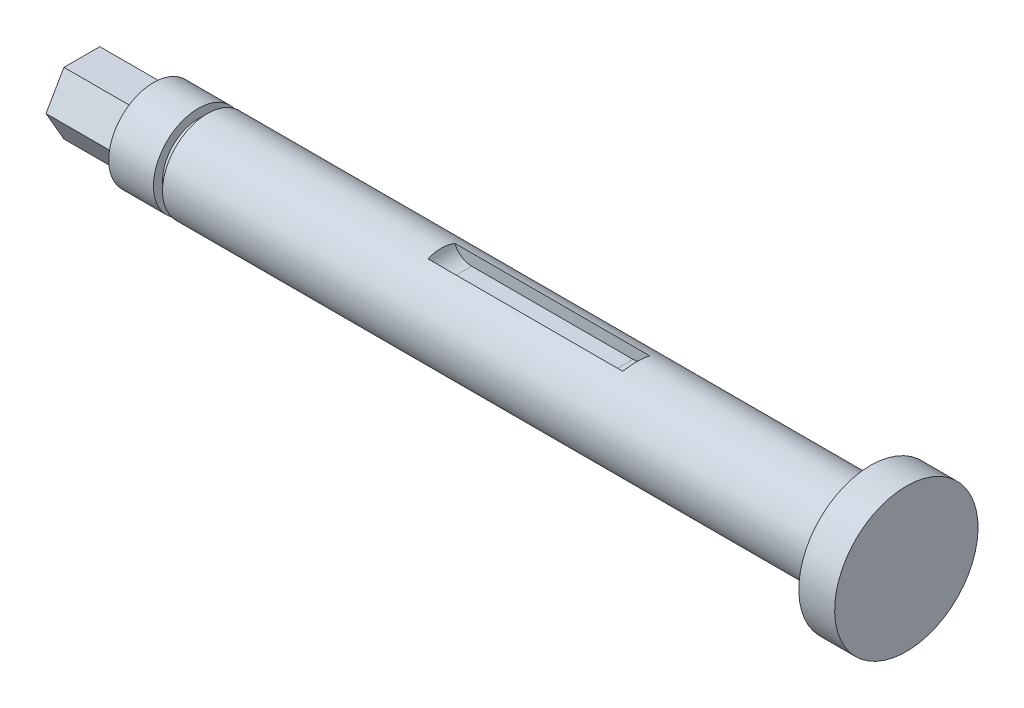
ISO-10303-21;
HEADER;
FILE_DESCRIPTION(('STEP AP214'),'2;1');
FILE_NAME('part.step','',(''),(''),'','','');
FILE_SCHEMA(('AUTOMOTIVE_DESIGN { 1 0 10303 214 1 1 1 1 }'));
ENDSEC;
DATA;
#1=APPLICATION_CONTEXT('core data for automotive mechanical design processes');
#2=APPLICATION_PROTOCOL_DEFINITION('international standard','automotive_design',2000,#1);
#3=PRODUCT_CONTEXT('',#1,'mechanical');
#4=PRODUCT('Part','Part','',(#3));
#5=PRODUCT_RELATED_PRODUCT_CATEGORY('part','',(#4));
#6=PRODUCT_DEFINITION_FORMATION('','',#4);
#7=PRODUCT_DEFINITION_CONTEXT('part definition',#1,'design');
#8=PRODUCT_DEFINITION('design','',#6,#7);
#9=PRODUCT_DEFINITION_SHAPE('','',#8);
#10=(LENGTH_UNIT() NAMED_UNIT(*) SI_UNIT(.MILLI.,.METRE.));
#11=(NAMED_UNIT(*) PLANE_ANGLE_UNIT() SI_UNIT($,.RADIAN.));
#12=(NAMED_UNIT(*) SI_UNIT($,.STERADIAN.) SOLID_ANGLE_UNIT());
#13=UNCERTAINTY_MEASURE_WITH_UNIT(LENGTH_MEASURE(1.E-05),#10,'distance_accuracy_value','');
#14=(GEOMETRIC_REPRESENTATION_CONTEXT(3) GLOBAL_UNCERTAINTY_ASSIGNED_CONTEXT((#13)) GLOBAL_UNIT_ASSIGNED_CONTEXT((#10,
#11,#12)) REPRESENTATION_CONTEXT('',''));
#15=CARTESIAN_POINT('',(0.,0.,0.));
#16=DIRECTION('',(0.,0.,1.));
#17=DIRECTION('',(1.,0.,0.));
#18=AXIS2_PLACEMENT_3D('',#15,#16,#17);
#19=CARTESIAN_POINT('',(-46.1818181818182,-7.85119649136424,0.));
#20=DIRECTION('',(1.,0.,0.));
#21=DIRECTION('',(0.,1.,0.));
#22=AXIS2_PLACEMENT_3D('',#19,#20,#21);
#23=CYLINDRICAL_SURFACE('',#22,7.93750000000001);
#24=CARTESIAN_POINT('',(-23.9568181818182,-7.85119649136424,0.));
#25=DIRECTION('',(1.,0.,0.));
#26=DIRECTION('',(0.,1.,0.));
#27=AXIS2_PLACEMENT_3D('',#24,#25,#26);
#28=CIRCLE('',#27,7.93750000000001);
#29=CARTESIAN_POINT('',(-23.9568181818182,0.086303508635777,0.));
#30=VERTEX_POINT('',#29);
#31=EDGE_CURVE('E188',#30,#30,#28,.T.);
#32=ORIENTED_EDGE('',*,*,#31,.T.);
#33=EDGE_LOOP('',(#32));
#34=FACE_BOUND('',#33,.T.);
#35=CARTESIAN_POINT('',(93.5181818181818,-7.85119649136422,0.));
#36=DIRECTION('',(1.,0.,0.));
#37=DIRECTION('',(0.,1.,0.));
#38=AXIS2_PLACEMENT_3D('',#35,#36,#37);
#39=CIRCLE('',#38,7.9375);
#40=CARTESIAN_POINT('',(93.5181818181818,0.086303508635777,0.));
#41=VERTEX_POINT('',#40);
#42=EDGE_CURVE('E185',#41,#41,#39,.T.);
#43=ORIENTED_EDGE('',*,*,#42,.F.);
#44=EDGE_LOOP('',(#43));
#45=FACE_BOUND('',#44,.T.);
#46=CARTESIAN_POINT('',(17.5349393500467,-0.279304080117218,-2.38125));
#47=CARTESIAN_POINT('',(17.5228895185475,-0.248359009768618,-2.28286114644571));
#48=CARTESIAN_POINT('',(17.5121096844206,-0.219295454956569,-2.18373394589652));
#49=CARTESIAN_POINT('',(17.4927586231369,-0.165013650373672,-1.98423094459988));
#50=CARTESIAN_POINT('',(17.4841871294751,-0.139794936753269,-1.88385529605055));
#51=CARTESIAN_POINT('',(17.4689224225592,-0.0932891865647346,-1.68210998868868));
#52=CARTESIAN_POINT('',(17.4622282739744,-0.0720001939449012,-1.58074085099974));
#53=CARTESIAN_POINT('',(17.4504514512222,-0.0333916842622112,-1.37716069329768));
#54=CARTESIAN_POINT('',(17.4453688229289,-0.0160722802029891,-1.2749496494035));
#55=CARTESIAN_POINT('',(17.4324227039563,0.0290913406343379,-0.972518602068045));
#56=CARTESIAN_POINT('',(17.4264980886517,0.0513241253093232,-0.771346365920783));
#57=CARTESIAN_POINT('',(17.4188612392676,0.0803582607489661,-0.367812192026644));
#58=CARTESIAN_POINT('',(17.4171495572141,0.0871575892391459,-0.165450101853548));
#59=CARTESIAN_POINT('',(17.4176245938068,0.0853059424343584,0.233209512953236));
#60=CARTESIAN_POINT('',(17.4196975229765,0.0771059287528459,0.429509408207358));
#61=CARTESIAN_POINT('',(17.4278765675394,0.0461819701231616,0.820870390108004));
#62=CARTESIAN_POINT('',(17.4339819769679,0.0234605674509423,1.01593168756148));
#63=CARTESIAN_POINT('',(17.4470306845615,-0.0217461985024105,1.30909544958882));
#64=CARTESIAN_POINT('',(17.4521157000533,-0.0389505457295152,1.40812396106605));
#65=CARTESIAN_POINT('',(17.4638218599536,-0.077087432528018,1.60537279101093));
#66=CARTESIAN_POINT('',(17.4704429621607,-0.0980198696729293,1.70359313160493));
#67=CARTESIAN_POINT('',(17.4854669834366,-0.143574944955858,1.89909267282386));
#68=CARTESIAN_POINT('',(17.4938708418505,-0.168199526493752,1.99637134891407));
#69=CARTESIAN_POINT('',(17.5127643709573,-0.221060949573087,2.18974831448237));
#70=CARTESIAN_POINT('',(17.5232542782489,-0.249298200731986,2.28584646875236));
#71=CARTESIAN_POINT('',(17.5349393500467,-0.279304080117219,2.38125));
#72=B_SPLINE_CURVE_WITH_KNOTS('',3,(#46,#47,#48,#49,#50,#51,#52,#53,#54,#55,#56,#57,#58,#59,#60,
#61,#62,#63,#64,#65,#66,#67,#68,#69,#70,#71),.UNSPECIFIED.,.F.,.F.,(4,2,2,2,2,2,2,2,2,2,2,2,4),
(0.,0.311486004627484,0.622934401155594,0.934227351103226,1.24552916163332,1.85227877141674,
2.459107880142,3.04799138422071,3.63677182003086,3.93862384263224,4.24046757335365,
4.54247074416797,4.84450818758329),.UNSPECIFIED.);
#73=CARTESIAN_POINT('',(17.5349393500467,-0.27930408011722,-2.38125));
#74=VERTEX_POINT('',#73);
#75=CARTESIAN_POINT('',(17.5349393500467,-0.27930408011722,2.38125));
#76=VERTEX_POINT('',#75);
#77=EDGE_CURVE('E205',#74,#76,#72,.T.);
#78=ORIENTED_EDGE('',*,*,#77,.F.);
#79=DIRECTION('',(1.,0.,0.));
#80=VECTOR('',#79,1.);
#81=CARTESIAN_POINT('',(-46.1818181818182,-0.279304080117227,-2.38125));
#82=LINE('',#81,#80);
#83=CARTESIAN_POINT('',(52.0264242863169,-0.279304080117215,-2.38125));
#84=VERTEX_POINT('',#83);
#85=EDGE_CURVE('E12',#74,#84,#82,.T.);
#86=ORIENTED_EDGE('',*,*,#85,.T.);
#87=CARTESIAN_POINT('',(52.0264242863169,-0.279304080117214,2.38125));
#88=CARTESIAN_POINT('',(52.0384741178162,-0.248359009768613,2.2828611464457));
#89=CARTESIAN_POINT('',(52.049253951943,-0.219295454956564,2.18373394589652));
#90=CARTESIAN_POINT('',(52.0686050132267,-0.165013650373667,1.98423094459988));
#91=CARTESIAN_POINT('',(52.0771765068885,-0.139794936753264,1.88385529605055));
#92=CARTESIAN_POINT('',(52.0924412138044,-0.09328918656473,1.68210998868868));
#93=CARTESIAN_POINT('',(52.0991353623892,-0.0720001939448968,1.58074085099974));
#94=CARTESIAN_POINT('',(52.1109121851415,-0.0333916842622071,1.37716069329768));
#95=CARTESIAN_POINT('',(52.1159948134348,-0.0160722802029851,1.2749496494035));
#96=CARTESIAN_POINT('',(52.1289409324073,0.0290913406343422,0.972518602068043));
#97=CARTESIAN_POINT('',(52.134865547712,0.0513241253093284,0.771346365920782));
#98=CARTESIAN_POINT('',(52.1425023970961,0.0803582607489722,0.367812192026645));
#99=CARTESIAN_POINT('',(52.1442140791496,0.0871575892391522,0.165450101853549));
#100=CARTESIAN_POINT('',(52.1437390425569,0.0853059424343649,-0.233209512953235));
#101=CARTESIAN_POINT('',(52.1416661133871,0.0771059287528523,-0.429509408207358));
#102=CARTESIAN_POINT('',(52.1334870688243,0.0461819701231663,-0.820870390108004));
#103=CARTESIAN_POINT('',(52.1273816593957,0.0234605674509453,-1.01593168756148));
#104=CARTESIAN_POINT('',(52.1143329518021,-0.0217461985024063,-1.30909544958883));
#105=CARTESIAN_POINT('',(52.1092479363103,-0.0389505457295099,-1.40812396106605));
#106=CARTESIAN_POINT('',(52.0975417764101,-0.0770874325280125,-1.60537279101093));
#107=CARTESIAN_POINT('',(52.090920674203,-0.0980198696729246,-1.70359313160493));
#108=CARTESIAN_POINT('',(52.0758966529271,-0.143574944955855,-1.89909267282387));
#109=CARTESIAN_POINT('',(52.0674927945132,-0.168199526493749,-1.99637134891407));
#110=CARTESIAN_POINT('',(52.0485992654063,-0.221060949573085,-2.18974831448238));
#111=CARTESIAN_POINT('',(52.0381093581148,-0.249298200731984,-2.28584646875237));
#112=CARTESIAN_POINT('',(52.0264242863169,-0.279304080117216,-2.38125));
#113=B_SPLINE_CURVE_WITH_KNOTS('',3,(#87,#88,#89,#90,#91,#92,#93,#94,#95,#96,#97,#98,#99,#100,
#101,#102,#103,#104,#105,#106,#107,#108,#109,#110,#111,#112),.UNSPECIFIED.,.F.,.F.,(4,2,2,2,2,2,
2,2,2,2,2,2,4),(0.,0.311486004627484,0.622934401155592,0.934227351103225,1.24552916163332,
1.85227877141674,2.459107880142,3.04799138422071,3.63677182003085,3.93862384263224,
4.24046757335365,4.54247074416797,4.84450818758329),.UNSPECIFIED.);
#114=CARTESIAN_POINT('',(52.0264242863169,-0.279304080117215,2.38125));
#115=VERTEX_POINT('',#114);
#116=EDGE_CURVE('E45',#115,#84,#113,.T.);
#117=ORIENTED_EDGE('',*,*,#116,.F.);
#118=DIRECTION('',(1.,0.,0.));
#119=VECTOR('',#118,1.);
#120=CARTESIAN_POINT('',(-46.1818181818182,-0.279304080117227,2.38125));
#121=LINE('',#120,#119);
#122=EDGE_CURVE('E203',#76,#115,#121,.T.);
#123=ORIENTED_EDGE('',*,*,#122,.F.);
#124=EDGE_LOOP('',(#78,#86,#117,#123));
#125=FACE_BOUND('',#124,.T.);
#126=ADVANCED_FACE('F37',(#34,#45,#125),#23,.T.);
#127=CARTESIAN_POINT('',(-33.4818181818182,-1.50119649136424,0.));
#128=DIRECTION('',(-1.,0.,0.));
#129=DIRECTION('',(0.,-1.,0.));
#130=AXIS2_PLACEMENT_3D('',#127,#128,#129);
#131=PLANE('',#130);
#132=DIRECTION('',(0.,0.,-1.));
#133=VECTOR('',#132,1.);
#134=CARTESIAN_POINT('',(-33.4818181818182,-13.3504578053955,-3.17499999999995));
#135=LINE('',#134,#133);
#136=CARTESIAN_POINT('',(-33.4818181818182,-13.3504578053954,3.17500000000007));
#137=VERTEX_POINT('',#136);
#138=CARTESIAN_POINT('',(-33.4818181818182,-13.3504578053955,-3.17499999999995));
#139=VERTEX_POINT('',#138);
#140=EDGE_CURVE('E60',#137,#139,#135,.T.);
#141=ORIENTED_EDGE('',*,*,#140,.T.);
#142=DIRECTION('',(0.,0.866025403784435,-0.500000000000007));
#143=VECTOR('',#142,1.);
#144=CARTESIAN_POINT('',(-33.4818181818182,-7.85119649136428,-6.35));
#145=LINE('',#144,#143);
#146=CARTESIAN_POINT('',(-33.4818181818182,-7.85119649136429,-6.35));
#147=VERTEX_POINT('',#146);
#148=EDGE_CURVE('E310',#139,#147,#145,.T.);
#149=ORIENTED_EDGE('',*,*,#148,.T.);
#150=DIRECTION('',(0.,0.866025403784442,0.499999999999995));
#151=VECTOR('',#150,1.);
#152=CARTESIAN_POINT('',(-33.4818181818182,-2.35193517733307,-3.17500000000003));
#153=LINE('',#152,#151);
#154=CARTESIAN_POINT('',(-33.4818181818182,-2.35193517733307,-3.17500000000003));
#155=VERTEX_POINT('',#154);
#156=EDGE_CURVE('E312',#147,#155,#153,.T.);
#157=ORIENTED_EDGE('',*,*,#156,.T.);
#158=DIRECTION('',(0.,0.,1.));
#159=VECTOR('',#158,1.);
#160=CARTESIAN_POINT('',(-33.4818181818182,-2.35193517733305,3.17499999999999));
#161=LINE('',#160,#159);
#162=CARTESIAN_POINT('',(-33.4818181818182,-2.35193517733304,3.17499999999998));
#163=VERTEX_POINT('',#162);
#164=EDGE_CURVE('E170',#155,#163,#161,.T.);
#165=ORIENTED_EDGE('',*,*,#164,.T.);
#166=DIRECTION('',(0.,-0.866025403784438,0.500000000000001));
#167=VECTOR('',#166,1.);
#168=CARTESIAN_POINT('',(-33.4818181818182,-7.85119649136424,6.35));
#169=LINE('',#168,#167);
#170=CARTESIAN_POINT('',(-33.4818181818182,-7.85119649136424,6.35));
#171=VERTEX_POINT('',#170);
#172=EDGE_CURVE('E118',#163,#171,#169,.T.);
#173=ORIENTED_EDGE('',*,*,#172,.T.);
#174=DIRECTION('',(0.,-0.866025403784442,-0.499999999999995));
#175=VECTOR('',#174,1.);
#176=CARTESIAN_POINT('',(-33.4818181818182,-13.3504578053954,3.17500000000006));
#177=LINE('',#176,#175);
#178=EDGE_CURVE('E156',#171,#137,#177,.T.);
#179=ORIENTED_EDGE('',*,*,#178,.T.);
#180=EDGE_LOOP('',(#141,#149,#157,#165,#173,#179));
#181=FACE_BOUND('',#180,.T.);
#182=CARTESIAN_POINT('',(-33.4818181818182,-7.85119649136424,0.));
#183=DIRECTION('',(1.,0.,0.));
#184=DIRECTION('',(0.,1.,0.));
#185=AXIS2_PLACEMENT_3D('',#182,#183,#184);
#186=CIRCLE('',#185,7.9375);
#187=CARTESIAN_POINT('',(-33.4818181818182,0.0863035086357596,0.));
#188=VERTEX_POINT('',#187);
#189=EDGE_CURVE('E200',#188,#188,#186,.T.);
#190=ORIENTED_EDGE('',*,*,#189,.F.);
#191=EDGE_LOOP('',(#190));
#192=FACE_BOUND('',#191,.T.);
#193=ADVANCED_FACE('F248',(#181,#192),#131,.T.);
#194=CARTESIAN_POINT('',(-46.1818181818182,-7.85119649136424,0.));
#195=DIRECTION('',(1.,0.,0.));
#196=DIRECTION('',(0.,1.,0.));
#197=AXIS2_PLACEMENT_3D('',#194,#195,#196);
#198=CYLINDRICAL_SURFACE('',#197,7.9375);
#199=ORIENTED_EDGE('',*,*,#189,.T.);
#200=EDGE_LOOP('',(#199));
#201=FACE_BOUND('',#200,.T.);
#202=CARTESIAN_POINT('',(-25.5570181818182,-7.85119649136424,0.));
#203=DIRECTION('',(1.,0.,0.));
#204=DIRECTION('',(0.,1.,0.));
#205=AXIS2_PLACEMENT_3D('',#202,#203,#204);
#206=CIRCLE('',#205,7.9375);
#207=CARTESIAN_POINT('',(-25.5570181818182,0.0863035086357614,0.));
#208=VERTEX_POINT('',#207);
#209=EDGE_CURVE('E197',#208,#208,#206,.T.);
#210=ORIENTED_EDGE('',*,*,#209,.F.);
#211=EDGE_LOOP('',(#210));
#212=FACE_BOUND('',#211,.T.);
#213=ADVANCED_FACE('F253',(#201,#212),#198,.T.);
#214=CARTESIAN_POINT('',(-25.5570181818182,0.0863035086357613,0.));
#215=DIRECTION('',(1.,0.,0.));
#216=DIRECTION('',(0.,1.,0.));
#217=AXIS2_PLACEMENT_3D('',#214,#215,#216);
#218=PLANE('',#217);
#219=ORIENTED_EDGE('',*,*,#209,.T.);
#220=EDGE_LOOP('',(#219));
#221=FACE_BOUND('',#220,.T.);
#222=CARTESIAN_POINT('',(-25.5570181818182,-7.85119649136424,0.));
#223=DIRECTION('',(1.,0.,0.));
#224=DIRECTION('',(0.,1.,0.));
#225=AXIS2_PLACEMENT_3D('',#222,#223,#224);
#226=CIRCLE('',#225,6.33730000000002);
#227=CARTESIAN_POINT('',(-25.5570181818182,-1.51389649136422,0.));
#228=VERTEX_POINT('',#227);
#229=EDGE_CURVE('E194',#228,#228,#226,.T.);
#230=ORIENTED_EDGE('',*,*,#229,.F.);
#231=EDGE_LOOP('',(#230));
#232=FACE_BOUND('',#231,.T.);
#233=ADVANCED_FACE('F322',(#221,#232),#218,.T.);
#234=CARTESIAN_POINT('',(-46.1818181818182,-7.85119649136424,0.));
#235=DIRECTION('',(1.,0.,0.));
#236=DIRECTION('',(0.,1.,0.));
#237=AXIS2_PLACEMENT_3D('',#234,#235,#236);
#238=CYLINDRICAL_SURFACE('',#237,6.33730000000002);
#239=ORIENTED_EDGE('',*,*,#229,.T.);
#240=EDGE_LOOP('',(#239));
#241=FACE_BOUND('',#240,.T.);
#242=CARTESIAN_POINT('',(-23.9568181818182,-7.85119649136424,0.));
#243=DIRECTION('',(1.,0.,0.));
#244=DIRECTION('',(0.,1.,0.));
#245=AXIS2_PLACEMENT_3D('',#242,#243,#244);
#246=CIRCLE('',#245,6.33730000000002);
#247=CARTESIAN_POINT('',(-23.9568181818182,-1.51389649136422,0.));
#248=VERTEX_POINT('',#247);
#249=EDGE_CURVE('E191',#248,#248,#246,.T.);
#250=ORIENTED_EDGE('',*,*,#249,.F.);
#251=EDGE_LOOP('',(#250));
#252=FACE_BOUND('',#251,.T.);
#253=ADVANCED_FACE('F244',(#241,#252),#238,.T.);
#254=CARTESIAN_POINT('',(-23.9568181818182,0.086303508635777,0.));
#255=DIRECTION('',(-1.,0.,0.));
#256=DIRECTION('',(0.,-1.,0.));
#257=AXIS2_PLACEMENT_3D('',#254,#255,#256);
#258=PLANE('',#257);
#259=ORIENTED_EDGE('',*,*,#249,.T.);
#260=EDGE_LOOP('',(#259));
#261=FACE_BOUND('',#260,.T.);
#262=ORIENTED_EDGE('',*,*,#31,.F.);
#263=EDGE_LOOP('',(#262));
#264=FACE_BOUND('',#263,.T.);
#265=ADVANCED_FACE('F239',(#261,#264),#258,.T.);
#266=CARTESIAN_POINT('',(93.5181818181818,4.84880350863578,0.));
#267=DIRECTION('',(-1.,0.,0.));
#268=DIRECTION('',(0.,-1.,0.));
#269=AXIS2_PLACEMENT_3D('',#266,#267,#268);
#270=PLANE('',#269);
#271=ORIENTED_EDGE('',*,*,#42,.T.);
#272=EDGE_LOOP('',(#271));
#273=FACE_BOUND('',#272,.T.);
#274=CARTESIAN_POINT('',(93.5181818181818,-7.85119649136422,0.));
#275=DIRECTION('',(1.,0.,0.));
#276=DIRECTION('',(0.,1.,0.));
#277=AXIS2_PLACEMENT_3D('',#274,#275,#276);
#278=CIRCLE('',#277,12.7);
#279=CARTESIAN_POINT('',(93.5181818181818,4.84880350863578,0.));
#280=VERTEX_POINT('',#279);
#281=EDGE_CURVE('E182',#280,#280,#278,.T.);
#282=ORIENTED_EDGE('',*,*,#281,.F.);
#283=EDGE_LOOP('',(#282));
#284=FACE_BOUND('',#283,.T.);
#285=ADVANCED_FACE('F236',(#273,#284),#270,.T.);
#286=CARTESIAN_POINT('',(-46.1818181818182,-7.85119649136424,0.));
#287=DIRECTION('',(1.,0.,0.));
#288=DIRECTION('',(0.,1.,0.));
#289=AXIS2_PLACEMENT_3D('',#286,#287,#288);
#290=CYLINDRICAL_SURFACE('',#289,12.7);
#291=ORIENTED_EDGE('',*,*,#281,.T.);
#292=EDGE_LOOP('',(#291));
#293=FACE_BOUND('',#292,.T.);
#294=CARTESIAN_POINT('',(99.8681818181818,-7.85119649136422,0.));
#295=DIRECTION('',(1.,0.,0.));
#296=DIRECTION('',(0.,1.,0.));
#297=AXIS2_PLACEMENT_3D('',#294,#295,#296);
#298=CIRCLE('',#297,12.7);
#299=CARTESIAN_POINT('',(99.8681818181818,4.84880350863578,0.));
#300=VERTEX_POINT('',#299);
#301=EDGE_CURVE('E177',#300,#300,#298,.T.);
#302=ORIENTED_EDGE('',*,*,#301,.F.);
#303=EDGE_LOOP('',(#302));
#304=FACE_BOUND('',#303,.T.);
#305=ADVANCED_FACE('F233',(#293,#304),#290,.T.);
#306=CARTESIAN_POINT('',(99.8681818181818,-7.85119649136422,0.));
#307=DIRECTION('',(1.,0.,0.));
#308=DIRECTION('',(0.,1.,0.));
#309=AXIS2_PLACEMENT_3D('',#306,#307,#308);
#310=PLANE('',#309);
#311=ORIENTED_EDGE('',*,*,#301,.T.);
#312=EDGE_LOOP('',(#311));
#313=FACE_BOUND('',#312,.T.);
#314=ADVANCED_FACE('F229',(#313),#310,.T.);
#315=CARTESIAN_POINT('',(49.0681818181818,0.873703508635783,-2.38125));
#316=DIRECTION('',(0.,0.,1.));
#317=DIRECTION('',(1.,0.,0.));
#318=AXIS2_PLACEMENT_3D('',#315,#316,#317);
#319=CYLINDRICAL_SURFACE('',#318,3.175);
#320=ORIENTED_EDGE('',*,*,#116,.T.);
#321=CARTESIAN_POINT('',(49.0681818181818,0.873703508635783,-2.38125));
#322=DIRECTION('',(0.,0.,1.));
#323=DIRECTION('',(1.,0.,0.));
#324=AXIS2_PLACEMENT_3D('',#321,#322,#323);
#325=CIRCLE('',#324,3.175);
#326=CARTESIAN_POINT('',(49.0681818181818,-2.30129649136422,-2.38125));
#327=VERTEX_POINT('',#326);
#328=EDGE_CURVE('E163',#327,#84,#325,.T.);
#329=ORIENTED_EDGE('',*,*,#328,.F.);
#330=DIRECTION('',(0.,0.,1.));
#331=VECTOR('',#330,1.);
#332=CARTESIAN_POINT('',(49.0681818181818,-2.30129649136422,-2.38125));
#333=LINE('',#332,#331);
#334=CARTESIAN_POINT('',(49.0681818181818,-2.30129649136422,2.38125));
#335=VERTEX_POINT('',#334);
#336=EDGE_CURVE('E175',#327,#335,#333,.T.);
#337=ORIENTED_EDGE('',*,*,#336,.T.);
#338=CARTESIAN_POINT('',(49.0681818181818,0.873703508635783,2.38125));
#339=DIRECTION('',(0.,0.,1.));
#340=DIRECTION('',(1.,0.,0.));
#341=AXIS2_PLACEMENT_3D('',#338,#339,#340);
#342=CIRCLE('',#341,3.175);
#343=EDGE_CURVE('E160',#335,#115,#342,.T.);
#344=ORIENTED_EDGE('',*,*,#343,.T.);
#345=EDGE_LOOP('',(#320,#329,#337,#344));
#346=FACE_BOUND('',#345,.T.);
#347=ADVANCED_FACE('F232',(#346),#319,.F.);
#348=CARTESIAN_POINT('',(20.4931818181818,-2.30129649136422,-2.38125));
#349=DIRECTION('',(0.,-1.,0.));
#350=DIRECTION('',(1.,0.,0.));
#351=AXIS2_PLACEMENT_3D('',#348,#349,#350);
#352=PLANE('',#351);
#353=DIRECTION('',(1.,0.,0.));
#354=VECTOR('',#353,1.);
#355=CARTESIAN_POINT('',(20.4931818181818,-2.30129649136422,2.38125));
#356=LINE('',#355,#354);
#357=CARTESIAN_POINT('',(20.4931818181818,-2.30129649136422,2.38125));
#358=VERTEX_POINT('',#357);
#359=EDGE_CURVE('E169',#358,#335,#356,.T.);
#360=ORIENTED_EDGE('',*,*,#359,.T.);
#361=ORIENTED_EDGE('',*,*,#336,.F.);
#362=DIRECTION('',(1.,0.,0.));
#363=VECTOR('',#362,1.);
#364=CARTESIAN_POINT('',(20.4931818181818,-2.30129649136422,-2.38125));
#365=LINE('',#364,#363);
#366=CARTESIAN_POINT('',(20.4931818181818,-2.30129649136422,-2.38125));
#367=VERTEX_POINT('',#366);
#368=EDGE_CURVE('E159',#367,#327,#365,.T.);
#369=ORIENTED_EDGE('',*,*,#368,.F.);
#370=DIRECTION('',(0.,0.,1.));
#371=VECTOR('',#370,1.);
#372=CARTESIAN_POINT('',(20.4931818181818,-2.30129649136422,-2.38125));
#373=LINE('',#372,#371);
#374=EDGE_CURVE('E166',#367,#358,#373,.T.);
#375=ORIENTED_EDGE('',*,*,#374,.T.);
#376=EDGE_LOOP('',(#360,#361,#369,#375));
#377=FACE_BOUND('',#376,.T.);
#378=ADVANCED_FACE('F227',(#377),#352,.F.);
#379=CARTESIAN_POINT('',(20.4931818181818,0.873703508635784,-2.38125));
#380=DIRECTION('',(0.,0.,1.));
#381=DIRECTION('',(1.,0.,0.));
#382=AXIS2_PLACEMENT_3D('',#379,#380,#381);
#383=CYLINDRICAL_SURFACE('',#382,3.175);
#384=ORIENTED_EDGE('',*,*,#77,.T.);
#385=CARTESIAN_POINT('',(20.4931818181818,0.873703508635784,2.38125));
#386=DIRECTION('',(0.,0.,1.));
#387=DIRECTION('',(1.,0.,0.));
#388=AXIS2_PLACEMENT_3D('',#385,#386,#387);
#389=CIRCLE('',#388,3.175);
#390=EDGE_CURVE('E167',#76,#358,#389,.T.);
#391=ORIENTED_EDGE('',*,*,#390,.T.);
#392=ORIENTED_EDGE('',*,*,#374,.F.);
#393=CARTESIAN_POINT('',(20.4931818181818,0.873703508635784,-2.38125));
#394=DIRECTION('',(0.,0.,1.));
#395=DIRECTION('',(1.,0.,0.));
#396=AXIS2_PLACEMENT_3D('',#393,#394,#395);
#397=CIRCLE('',#396,3.175);
#398=EDGE_CURVE('E157',#74,#367,#397,.T.);
#399=ORIENTED_EDGE('',*,*,#398,.F.);
#400=EDGE_LOOP('',(#384,#391,#392,#399));
#401=FACE_BOUND('',#400,.T.);
#402=ADVANCED_FACE('F221',(#401),#383,.F.);
#403=CARTESIAN_POINT('',(20.4931818181818,0.873703508635784,-2.38125));
#404=DIRECTION('',(0.,0.,1.));
#405=DIRECTION('',(1.,0.,0.));
#406=AXIS2_PLACEMENT_3D('',#403,#404,#405);
#407=PLANE('',#406);
#408=ORIENTED_EDGE('',*,*,#398,.T.);
#409=ORIENTED_EDGE('',*,*,#368,.T.);
#410=ORIENTED_EDGE('',*,*,#328,.T.);
#411=ORIENTED_EDGE('',*,*,#85,.F.);
#412=EDGE_LOOP('',(#408,#409,#410,#411));
#413=FACE_BOUND('',#412,.T.);
#414=ADVANCED_FACE('F226',(#413),#407,.T.);
#415=CARTESIAN_POINT('',(20.4931818181818,0.873703508635784,2.38125));
#416=DIRECTION('',(0.,0.,1.));
#417=DIRECTION('',(1.,0.,0.));
#418=AXIS2_PLACEMENT_3D('',#415,#416,#417);
#419=PLANE('',#418);
#420=ORIENTED_EDGE('',*,*,#122,.T.);
#421=ORIENTED_EDGE('',*,*,#343,.F.);
#422=ORIENTED_EDGE('',*,*,#359,.F.);
#423=ORIENTED_EDGE('',*,*,#390,.F.);
#424=EDGE_LOOP('',(#420,#421,#422,#423));
#425=FACE_BOUND('',#424,.T.);
#426=ADVANCED_FACE('F270',(#425),#419,.F.);
#427=CARTESIAN_POINT('',(10.0810658545904,-7.85119649136423,6.35));
#428=DIRECTION('',(0.,0.500000000000001,0.866025403784438));
#429=DIRECTION('',(0.,-0.866025403784438,0.500000000000001));
#430=AXIS2_PLACEMENT_3D('',#427,#428,#429);
#431=PLANE('',#430);
#432=DIRECTION('',(-1.,0.,0.));
#433=VECTOR('',#432,1.);
#434=CARTESIAN_POINT('',(10.0810658545904,-2.35193517733304,3.17499999999999));
#435=LINE('',#434,#433);
#436=CARTESIAN_POINT('',(-46.1818181818182,-2.35193517733305,3.17499999999999));
#437=VERTEX_POINT('',#436);
#438=EDGE_CURVE('E114',#163,#437,#435,.T.);
#439=ORIENTED_EDGE('',*,*,#438,.T.);
#440=DIRECTION('',(0.,0.866025403784438,-0.500000000000001));
#441=VECTOR('',#440,1.);
#442=CARTESIAN_POINT('',(-46.1818181818182,-7.85119649136424,6.35));
#443=LINE('',#442,#441);
#444=CARTESIAN_POINT('',(-46.1818181818182,-7.85119649136424,6.35));
#445=VERTEX_POINT('',#444);
#446=EDGE_CURVE('E52',#445,#437,#443,.T.);
#447=ORIENTED_EDGE('',*,*,#446,.F.);
#448=DIRECTION('',(-1.,0.,0.));
#449=VECTOR('',#448,1.);
#450=CARTESIAN_POINT('',(10.0810658545904,-7.85119649136423,6.35));
#451=LINE('',#450,#449);
#452=EDGE_CURVE('E122',#171,#445,#451,.T.);
#453=ORIENTED_EDGE('',*,*,#452,.F.);
#454=ORIENTED_EDGE('',*,*,#172,.F.);
#455=EDGE_LOOP('',(#439,#447,#453,#454));
#456=FACE_BOUND('',#455,.T.);
#457=ADVANCED_FACE('F116',(#456),#431,.T.);
#458=CARTESIAN_POINT('',(10.0810658545904,-2.35193517733304,3.17499999999999));
#459=DIRECTION('',(0.,1.,0.));
#460=DIRECTION('',(0.,0.,1.));
#461=AXIS2_PLACEMENT_3D('',#458,#459,#460);
#462=PLANE('',#461);
#463=DIRECTION('',(-1.,0.,0.));
#464=VECTOR('',#463,1.);
#465=CARTESIAN_POINT('',(10.0810658545904,-2.35193517733306,-3.17500000000003));
#466=LINE('',#465,#464);
#467=CARTESIAN_POINT('',(-46.1818181818182,-2.35193517733307,-3.17500000000003));
#468=VERTEX_POINT('',#467);
#469=EDGE_CURVE('E121',#155,#468,#466,.T.);
#470=ORIENTED_EDGE('',*,*,#469,.T.);
#471=DIRECTION('',(0.,0.,-1.));
#472=VECTOR('',#471,1.);
#473=CARTESIAN_POINT('',(-46.1818181818182,-2.35193517733305,3.17499999999999));
#474=LINE('',#473,#472);
#475=EDGE_CURVE('E125',#437,#468,#474,.T.);
#476=ORIENTED_EDGE('',*,*,#475,.F.);
#477=ORIENTED_EDGE('',*,*,#438,.F.);
#478=ORIENTED_EDGE('',*,*,#164,.F.);
#479=EDGE_LOOP('',(#470,#476,#477,#478));
#480=FACE_BOUND('',#479,.T.);
#481=ADVANCED_FACE('F126',(#480),#462,.T.);
#482=CARTESIAN_POINT('',(10.0810658545904,-2.35193517733306,-3.17500000000003));
#483=DIRECTION('',(0.,0.499999999999995,-0.866025403784442));
#484=DIRECTION('',(0.,0.866025403784442,0.499999999999995));
#485=AXIS2_PLACEMENT_3D('',#482,#483,#484);
#486=PLANE('',#485);
#487=DIRECTION('',(-1.,0.,0.));
#488=VECTOR('',#487,1.);
#489=CARTESIAN_POINT('',(10.0810658545904,-7.85119649136428,-6.35));
#490=LINE('',#489,#488);
#491=CARTESIAN_POINT('',(-46.1818181818182,-7.85119649136429,-6.35));
#492=VERTEX_POINT('',#491);
#493=EDGE_CURVE('E151',#147,#492,#490,.T.);
#494=ORIENTED_EDGE('',*,*,#493,.T.);
#495=DIRECTION('',(0.,-0.866025403784441,-0.499999999999995));
#496=VECTOR('',#495,1.);
#497=CARTESIAN_POINT('',(-46.1818181818182,-2.35193517733307,-3.17500000000003));
#498=LINE('',#497,#496);
#499=EDGE_CURVE('E131',#468,#492,#498,.T.);
#500=ORIENTED_EDGE('',*,*,#499,.F.);
#501=ORIENTED_EDGE('',*,*,#469,.F.);
#502=ORIENTED_EDGE('',*,*,#156,.F.);
#503=EDGE_LOOP('',(#494,#500,#501,#502));
#504=FACE_BOUND('',#503,.T.);
#505=ADVANCED_FACE('F293',(#504),#486,.T.);
#506=CARTESIAN_POINT('',(10.0810658545904,-7.85119649136428,-6.35));
#507=DIRECTION('',(0.,-0.500000000000007,-0.866025403784434));
#508=DIRECTION('',(0.,0.866025403784435,-0.500000000000007));
#509=AXIS2_PLACEMENT_3D('',#506,#507,#508);
#510=PLANE('',#509);
#511=DIRECTION('',(-1.,0.,0.));
#512=VECTOR('',#511,1.);
#513=CARTESIAN_POINT('',(10.0810658545904,-13.3504578053954,-3.17499999999995));
#514=LINE('',#513,#512);
#515=CARTESIAN_POINT('',(-46.1818181818182,-13.3504578053955,-3.17499999999995));
#516=VERTEX_POINT('',#515);
#517=EDGE_CURVE('E149',#139,#516,#514,.T.);
#518=ORIENTED_EDGE('',*,*,#517,.T.);
#519=DIRECTION('',(0.,-0.866025403784435,0.500000000000007));
#520=VECTOR('',#519,1.);
#521=CARTESIAN_POINT('',(-46.1818181818182,-7.85119649136429,-6.35));
#522=LINE('',#521,#520);
#523=EDGE_CURVE('E142',#492,#516,#522,.T.);
#524=ORIENTED_EDGE('',*,*,#523,.F.);
#525=ORIENTED_EDGE('',*,*,#493,.F.);
#526=ORIENTED_EDGE('',*,*,#148,.F.);
#527=EDGE_LOOP('',(#518,#524,#525,#526));
#528=FACE_BOUND('',#527,.T.);
#529=ADVANCED_FACE('F296',(#528),#510,.T.);
#530=CARTESIAN_POINT('',(10.0810658545904,-13.3504578053954,-3.17499999999995));
#531=DIRECTION('',(0.,-1.,0.));
#532=DIRECTION('',(0.,0.,-1.));
#533=AXIS2_PLACEMENT_3D('',#530,#531,#532);
#534=PLANE('',#533);
#535=DIRECTION('',(-1.,0.,0.));
#536=VECTOR('',#535,1.);
#537=CARTESIAN_POINT('',(10.0810658545904,-13.3504578053954,3.17500000000006));
#538=LINE('',#537,#536);
#539=CARTESIAN_POINT('',(-46.1818181818182,-13.3504578053954,3.17500000000006));
#540=VERTEX_POINT('',#539);
#541=EDGE_CURVE('E147',#137,#540,#538,.T.);
#542=ORIENTED_EDGE('',*,*,#541,.T.);
#543=DIRECTION('',(0.,0.,1.));
#544=VECTOR('',#543,1.);
#545=CARTESIAN_POINT('',(-46.1818181818182,-13.3504578053955,-3.17499999999995));
#546=LINE('',#545,#544);
#547=EDGE_CURVE('E145',#516,#540,#546,.T.);
#548=ORIENTED_EDGE('',*,*,#547,.F.);
#549=ORIENTED_EDGE('',*,*,#517,.F.);
#550=ORIENTED_EDGE('',*,*,#140,.F.);
#551=EDGE_LOOP('',(#542,#548,#549,#550));
#552=FACE_BOUND('',#551,.T.);
#553=ADVANCED_FACE('F287',(#552),#534,.T.);
#554=CARTESIAN_POINT('',(10.0810658545904,-13.3504578053954,3.17500000000006));
#555=DIRECTION('',(0.,-0.499999999999995,0.866025403784441));
#556=DIRECTION('',(0.,-0.866025403784442,-0.499999999999995));
#557=AXIS2_PLACEMENT_3D('',#554,#555,#556);
#558=PLANE('',#557);
#559=ORIENTED_EDGE('',*,*,#452,.T.);
#560=DIRECTION('',(0.,0.866025403784442,0.499999999999995));
#561=VECTOR('',#560,1.);
#562=CARTESIAN_POINT('',(-46.1818181818182,-13.3504578053954,3.17500000000006));
#563=LINE('',#562,#561);
#564=EDGE_CURVE('E136',#540,#445,#563,.T.);
#565=ORIENTED_EDGE('',*,*,#564,.F.);
#566=ORIENTED_EDGE('',*,*,#541,.F.);
#567=ORIENTED_EDGE('',*,*,#178,.F.);
#568=EDGE_LOOP('',(#559,#565,#566,#567));
#569=FACE_BOUND('',#568,.T.);
#570=ADVANCED_FACE('F284',(#569),#558,.T.);
#571=CARTESIAN_POINT('',(-46.1818181818182,-7.85119649136424,0.));
#572=DIRECTION('',(-1.,0.,0.));
#573=DIRECTION('',(0.,-1.,0.));
#574=AXIS2_PLACEMENT_3D('',#571,#572,#573);
#575=PLANE('',#574);
#576=ORIENTED_EDGE('',*,*,#564,.T.);
#577=ORIENTED_EDGE('',*,*,#446,.T.);
#578=ORIENTED_EDGE('',*,*,#475,.T.);
#579=ORIENTED_EDGE('',*,*,#499,.T.);
#580=ORIENTED_EDGE('',*,*,#523,.T.);
#581=ORIENTED_EDGE('',*,*,#547,.T.);
#582=EDGE_LOOP('',(#576,#577,#578,#579,#580,#581));
#583=FACE_BOUND('',#582,.T.);
#584=ADVANCED_FACE('F39',(#583),#575,.T.);
#585=CLOSED_SHELL('',(#126,#193,#213,#233,#253,#265,#285,#305,#314,#347,#378,#402,#414,#426,
#457,#481,#505,#529,#553,#570,#584));
#586=MANIFOLD_SOLID_BREP('B2',#585);
#587=ADVANCED_BREP_SHAPE_REPRESENTATION('',(#18,#586),#14);
#588=SHAPE_DEFINITION_REPRESENTATION(#9,#587);
ENDSEC;
END-ISO-10303-21;
